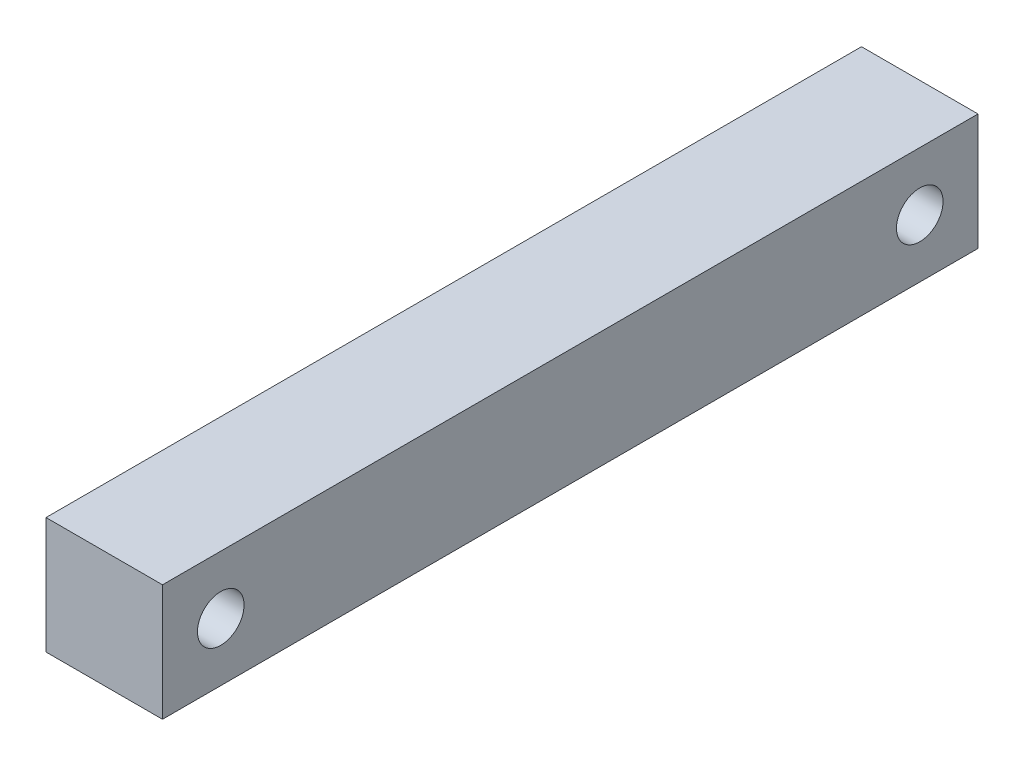
ISO-10303-21;
HEADER;
FILE_DESCRIPTION(('STEP AP214'),'2;1');
FILE_NAME('part.step','',(''),(''),'','','');
FILE_SCHEMA(('AUTOMOTIVE_DESIGN { 1 0 10303 214 1 1 1 1 }'));
ENDSEC;
DATA;
#1=APPLICATION_CONTEXT('core data for automotive mechanical design processes');
#2=APPLICATION_PROTOCOL_DEFINITION('international standard','automotive_design',2000,#1);
#3=PRODUCT_CONTEXT('',#1,'mechanical');
#4=PRODUCT('Part','Part','',(#3));
#5=PRODUCT_RELATED_PRODUCT_CATEGORY('part','',(#4));
#6=PRODUCT_DEFINITION_FORMATION('','',#4);
#7=PRODUCT_DEFINITION_CONTEXT('part definition',#1,'design');
#8=PRODUCT_DEFINITION('design','',#6,#7);
#9=PRODUCT_DEFINITION_SHAPE('','',#8);
#10=(LENGTH_UNIT() NAMED_UNIT(*) SI_UNIT(.MILLI.,.METRE.));
#11=(NAMED_UNIT(*) PLANE_ANGLE_UNIT() SI_UNIT($,.RADIAN.));
#12=(NAMED_UNIT(*) SI_UNIT($,.STERADIAN.) SOLID_ANGLE_UNIT());
#13=UNCERTAINTY_MEASURE_WITH_UNIT(LENGTH_MEASURE(1.E-05),#10,'distance_accuracy_value','');
#14=(GEOMETRIC_REPRESENTATION_CONTEXT(3) GLOBAL_UNCERTAINTY_ASSIGNED_CONTEXT((#13)) GLOBAL_UNIT_ASSIGNED_CONTEXT((#10,
#11,#12)) REPRESENTATION_CONTEXT('',''));
#15=CARTESIAN_POINT('',(0.,0.,0.));
#16=DIRECTION('',(0.,0.,1.));
#17=DIRECTION('',(1.,0.,0.));
#18=AXIS2_PLACEMENT_3D('',#15,#16,#17);
#19=CARTESIAN_POINT('',(2.5,5.,-17.5));
#20=DIRECTION('',(-1.,0.,0.));
#21=DIRECTION('',(0.,0.,1.));
#22=AXIS2_PLACEMENT_3D('',#19,#20,#21);
#23=PLANE('',#22);
#24=CARTESIAN_POINT('',(2.5,2.5,15.));
#25=DIRECTION('',(-1.,0.,0.));
#26=DIRECTION('',(0.,0.,1.));
#27=AXIS2_PLACEMENT_3D('',#24,#25,#26);
#28=CIRCLE('',#27,1.);
#29=CARTESIAN_POINT('',(2.5,2.5,14.));
#30=VERTEX_POINT('',#29);
#31=EDGE_CURVE('E116',#30,#30,#28,.T.);
#32=ORIENTED_EDGE('',*,*,#31,.T.);
#33=EDGE_LOOP('',(#32));
#34=FACE_BOUND('',#33,.T.);
#35=CARTESIAN_POINT('',(2.5,2.5,-15.));
#36=DIRECTION('',(1.,0.,0.));
#37=DIRECTION('',(0.,0.,-1.));
#38=AXIS2_PLACEMENT_3D('',#35,#36,#37);
#39=CIRCLE('',#38,1.);
#40=CARTESIAN_POINT('',(2.5,2.5,-16.));
#41=VERTEX_POINT('',#40);
#42=EDGE_CURVE('E110',#41,#41,#39,.T.);
#43=ORIENTED_EDGE('',*,*,#42,.F.);
#44=EDGE_LOOP('',(#43));
#45=FACE_BOUND('',#44,.T.);
#46=DIRECTION('',(0.,0.,-1.));
#47=VECTOR('',#46,1.);
#48=CARTESIAN_POINT('',(2.5,0.,-17.5));
#49=LINE('',#48,#47);
#50=CARTESIAN_POINT('',(2.5,0.,17.5));
#51=VERTEX_POINT('',#50);
#52=CARTESIAN_POINT('',(2.5,0.,-17.5));
#53=VERTEX_POINT('',#52);
#54=EDGE_CURVE('E96',#51,#53,#49,.T.);
#55=ORIENTED_EDGE('',*,*,#54,.T.);
#56=DIRECTION('',(0.,-1.,0.));
#57=VECTOR('',#56,1.);
#58=CARTESIAN_POINT('',(2.5,5.,-17.5));
#59=LINE('',#58,#57);
#60=CARTESIAN_POINT('',(2.5,5.,-17.5));
#61=VERTEX_POINT('',#60);
#62=EDGE_CURVE('E11',#61,#53,#59,.T.);
#63=ORIENTED_EDGE('',*,*,#62,.F.);
#64=DIRECTION('',(0.,0.,-1.));
#65=VECTOR('',#64,1.);
#66=CARTESIAN_POINT('',(2.5,5.,-17.5));
#67=LINE('',#66,#65);
#68=CARTESIAN_POINT('',(2.5,5.,17.5));
#69=VERTEX_POINT('',#68);
#70=EDGE_CURVE('E84',#69,#61,#67,.T.);
#71=ORIENTED_EDGE('',*,*,#70,.F.);
#72=DIRECTION('',(0.,-1.,0.));
#73=VECTOR('',#72,1.);
#74=CARTESIAN_POINT('',(2.5,5.,17.5));
#75=LINE('',#74,#73);
#76=EDGE_CURVE('E92',#69,#51,#75,.T.);
#77=ORIENTED_EDGE('',*,*,#76,.T.);
#78=EDGE_LOOP('',(#55,#63,#71,#77));
#79=FACE_BOUND('',#78,.T.);
#80=ADVANCED_FACE('F33',(#34,#45,#79),#23,.F.);
#81=CARTESIAN_POINT('',(-2.5,5.,-17.5));
#82=DIRECTION('',(0.,0.,1.));
#83=DIRECTION('',(1.,0.,0.));
#84=AXIS2_PLACEMENT_3D('',#81,#82,#83);
#85=PLANE('',#84);
#86=DIRECTION('',(-1.,0.,0.));
#87=VECTOR('',#86,1.);
#88=CARTESIAN_POINT('',(-2.5,0.,-17.5));
#89=LINE('',#88,#87);
#90=CARTESIAN_POINT('',(-2.5,0.,-17.5));
#91=VERTEX_POINT('',#90);
#92=EDGE_CURVE('E88',#53,#91,#89,.T.);
#93=ORIENTED_EDGE('',*,*,#92,.T.);
#94=DIRECTION('',(0.,-1.,0.));
#95=VECTOR('',#94,1.);
#96=CARTESIAN_POINT('',(-2.5,5.,-17.5));
#97=LINE('',#96,#95);
#98=CARTESIAN_POINT('',(-2.5,5.,-17.5));
#99=VERTEX_POINT('',#98);
#100=EDGE_CURVE('E41',#99,#91,#97,.T.);
#101=ORIENTED_EDGE('',*,*,#100,.F.);
#102=DIRECTION('',(-1.,0.,0.));
#103=VECTOR('',#102,1.);
#104=CARTESIAN_POINT('',(-2.5,5.,-17.5));
#105=LINE('',#104,#103);
#106=EDGE_CURVE('E79',#61,#99,#105,.T.);
#107=ORIENTED_EDGE('',*,*,#106,.F.);
#108=ORIENTED_EDGE('',*,*,#62,.T.);
#109=EDGE_LOOP('',(#93,#101,#107,#108));
#110=FACE_BOUND('',#109,.T.);
#111=ADVANCED_FACE('F87',(#110),#85,.F.);
#112=CARTESIAN_POINT('',(-2.5,5.,-17.5));
#113=DIRECTION('',(1.,0.,0.));
#114=DIRECTION('',(0.,0.,-1.));
#115=AXIS2_PLACEMENT_3D('',#112,#113,#114);
#116=PLANE('',#115);
#117=CARTESIAN_POINT('',(-2.50000000000001,2.5,15.));
#118=DIRECTION('',(-1.,0.,0.));
#119=DIRECTION('',(0.,0.,1.));
#120=AXIS2_PLACEMENT_3D('',#117,#118,#119);
#121=CIRCLE('',#120,1.);
#122=CARTESIAN_POINT('',(-2.50000000000001,2.5,14.));
#123=VERTEX_POINT('',#122);
#124=EDGE_CURVE('E113',#123,#123,#121,.T.);
#125=ORIENTED_EDGE('',*,*,#124,.F.);
#126=EDGE_LOOP('',(#125));
#127=FACE_BOUND('',#126,.T.);
#128=CARTESIAN_POINT('',(-2.50000000000001,2.5,-15.));
#129=DIRECTION('',(1.,0.,0.));
#130=DIRECTION('',(0.,0.,-1.));
#131=AXIS2_PLACEMENT_3D('',#128,#129,#130);
#132=CIRCLE('',#131,1.);
#133=CARTESIAN_POINT('',(-2.50000000000001,2.5,-16.));
#134=VERTEX_POINT('',#133);
#135=EDGE_CURVE('E99',#134,#134,#132,.T.);
#136=ORIENTED_EDGE('',*,*,#135,.T.);
#137=EDGE_LOOP('',(#136));
#138=FACE_BOUND('',#137,.T.);
#139=DIRECTION('',(0.,0.,1.));
#140=VECTOR('',#139,1.);
#141=CARTESIAN_POINT('',(-2.5,0.,-17.5));
#142=LINE('',#141,#140);
#143=CARTESIAN_POINT('',(-2.5,0.,17.5));
#144=VERTEX_POINT('',#143);
#145=EDGE_CURVE('E66',#91,#144,#142,.T.);
#146=ORIENTED_EDGE('',*,*,#145,.T.);
#147=DIRECTION('',(0.,-1.,0.));
#148=VECTOR('',#147,1.);
#149=CARTESIAN_POINT('',(-2.5,5.,17.5));
#150=LINE('',#149,#148);
#151=CARTESIAN_POINT('',(-2.5,5.,17.5));
#152=VERTEX_POINT('',#151);
#153=EDGE_CURVE('E89',#152,#144,#150,.T.);
#154=ORIENTED_EDGE('',*,*,#153,.F.);
#155=DIRECTION('',(0.,0.,1.));
#156=VECTOR('',#155,1.);
#157=CARTESIAN_POINT('',(-2.5,5.,-17.5));
#158=LINE('',#157,#156);
#159=EDGE_CURVE('E82',#99,#152,#158,.T.);
#160=ORIENTED_EDGE('',*,*,#159,.F.);
#161=ORIENTED_EDGE('',*,*,#100,.T.);
#162=EDGE_LOOP('',(#146,#154,#160,#161));
#163=FACE_BOUND('',#162,.T.);
#164=ADVANCED_FACE('F90',(#127,#138,#163),#116,.F.);
#165=CARTESIAN_POINT('',(-2.5,5.,17.5));
#166=DIRECTION('',(0.,0.,-1.));
#167=DIRECTION('',(-1.,0.,0.));
#168=AXIS2_PLACEMENT_3D('',#165,#166,#167);
#169=PLANE('',#168);
#170=DIRECTION('',(1.,0.,0.));
#171=VECTOR('',#170,1.);
#172=CARTESIAN_POINT('',(-2.5,0.,17.5));
#173=LINE('',#172,#171);
#174=EDGE_CURVE('E72',#144,#51,#173,.T.);
#175=ORIENTED_EDGE('',*,*,#174,.T.);
#176=ORIENTED_EDGE('',*,*,#76,.F.);
#177=DIRECTION('',(1.,0.,0.));
#178=VECTOR('',#177,1.);
#179=CARTESIAN_POINT('',(-2.5,5.,17.5));
#180=LINE('',#179,#178);
#181=EDGE_CURVE('E49',#152,#69,#180,.T.);
#182=ORIENTED_EDGE('',*,*,#181,.F.);
#183=ORIENTED_EDGE('',*,*,#153,.T.);
#184=EDGE_LOOP('',(#175,#176,#182,#183));
#185=FACE_BOUND('',#184,.T.);
#186=ADVANCED_FACE('F104',(#185),#169,.F.);
#187=CARTESIAN_POINT('',(0.,5.,0.));
#188=DIRECTION('',(0.,1.,0.));
#189=DIRECTION('',(0.,0.,1.));
#190=AXIS2_PLACEMENT_3D('',#187,#188,#189);
#191=PLANE('',#190);
#192=ORIENTED_EDGE('',*,*,#70,.T.);
#193=ORIENTED_EDGE('',*,*,#106,.T.);
#194=ORIENTED_EDGE('',*,*,#159,.T.);
#195=ORIENTED_EDGE('',*,*,#181,.T.);
#196=EDGE_LOOP('',(#192,#193,#194,#195));
#197=FACE_BOUND('',#196,.T.);
#198=ADVANCED_FACE('F80',(#197),#191,.T.);
#199=CARTESIAN_POINT('',(0.,0.,0.));
#200=DIRECTION('',(0.,1.,0.));
#201=DIRECTION('',(0.,0.,1.));
#202=AXIS2_PLACEMENT_3D('',#199,#200,#201);
#203=PLANE('',#202);
#204=ORIENTED_EDGE('',*,*,#54,.F.);
#205=ORIENTED_EDGE('',*,*,#174,.F.);
#206=ORIENTED_EDGE('',*,*,#145,.F.);
#207=ORIENTED_EDGE('',*,*,#92,.F.);
#208=EDGE_LOOP('',(#204,#205,#206,#207));
#209=FACE_BOUND('',#208,.T.);
#210=ADVANCED_FACE('F107',(#209),#203,.F.);
#211=CARTESIAN_POINT('',(-2.50000000000001,2.5,-15.));
#212=DIRECTION('',(1.,0.,0.));
#213=DIRECTION('',(0.,0.,-1.));
#214=AXIS2_PLACEMENT_3D('',#211,#212,#213);
#215=CYLINDRICAL_SURFACE('',#214,1.);
#216=ORIENTED_EDGE('',*,*,#135,.F.);
#217=EDGE_LOOP('',(#216));
#218=FACE_BOUND('',#217,.T.);
#219=ORIENTED_EDGE('',*,*,#42,.T.);
#220=EDGE_LOOP('',(#219));
#221=FACE_BOUND('',#220,.T.);
#222=ADVANCED_FACE('F130',(#218,#221),#215,.F.);
#223=CARTESIAN_POINT('',(-2.50000000000001,2.5,15.));
#224=DIRECTION('',(1.,0.,0.));
#225=DIRECTION('',(0.,0.,-1.));
#226=AXIS2_PLACEMENT_3D('',#223,#224,#225);
#227=CYLINDRICAL_SURFACE('',#226,1.);
#228=CARTESIAN_POINT('',(-2.50000000000001,2.5,14.));
#229=CARTESIAN_POINT('',(-2.44791666666668,2.5,14.));
#230=CARTESIAN_POINT('',(-2.39583333333335,2.5,14.));
#231=CARTESIAN_POINT('',(-2.29166666666668,2.5,14.));
#232=CARTESIAN_POINT('',(-2.23958333333334,2.5,14.));
#233=CARTESIAN_POINT('',(-2.13541666666668,2.5,14.));
#234=CARTESIAN_POINT('',(-2.08333333333334,2.5,14.));
#235=CARTESIAN_POINT('',(-1.97916666666668,2.5,14.));
#236=CARTESIAN_POINT('',(-1.92708333333334,2.5,14.));
#237=CARTESIAN_POINT('',(-1.82291666666668,2.5,14.));
#238=CARTESIAN_POINT('',(-1.77083333333334,2.5,14.));
#239=CARTESIAN_POINT('',(-1.66666666666668,2.5,14.));
#240=CARTESIAN_POINT('',(-1.61458333333334,2.5,14.));
#241=CARTESIAN_POINT('',(-1.51041666666668,2.5,14.));
#242=CARTESIAN_POINT('',(-1.45833333333334,2.5,14.));
#243=CARTESIAN_POINT('',(-1.35416666666668,2.5,14.));
#244=CARTESIAN_POINT('',(-1.30208333333334,2.5,14.));
#245=CARTESIAN_POINT('',(-1.19791666666668,2.5,14.));
#246=CARTESIAN_POINT('',(-1.14583333333334,2.5,14.));
#247=CARTESIAN_POINT('',(-1.04166666666668,2.5,14.));
#248=CARTESIAN_POINT('',(-0.989583333333342,2.5,14.));
#249=CARTESIAN_POINT('',(-0.885416666666675,2.5,14.));
#250=CARTESIAN_POINT('',(-0.833333333333341,2.5,14.));
#251=CARTESIAN_POINT('',(-0.729166666666674,2.5,14.));
#252=CARTESIAN_POINT('',(-0.677083333333341,2.5,14.));
#253=CARTESIAN_POINT('',(-0.572916666666674,2.5,14.));
#254=CARTESIAN_POINT('',(-0.520833333333341,2.5,14.));
#255=CARTESIAN_POINT('',(-0.416666666666674,2.5,14.));
#256=CARTESIAN_POINT('',(-0.364583333333341,2.5,14.));
#257=CARTESIAN_POINT('',(-0.260416666666674,2.5,14.));
#258=CARTESIAN_POINT('',(-0.20833333333334,2.5,14.));
#259=CARTESIAN_POINT('',(-0.104166666666673,2.5,14.));
#260=CARTESIAN_POINT('',(-0.0520833333333399,2.5,14.));
#261=CARTESIAN_POINT('',(0.0520833333333269,2.5,14.));
#262=CARTESIAN_POINT('',(0.10416666666666,2.5,14.));
#263=CARTESIAN_POINT('',(0.208333333333327,2.5,14.));
#264=CARTESIAN_POINT('',(0.260416666666661,2.5,14.));
#265=CARTESIAN_POINT('',(0.364583333333328,2.5,14.));
#266=CARTESIAN_POINT('',(0.416666666666661,2.5,14.));
#267=CARTESIAN_POINT('',(0.520833333333328,2.5,14.));
#268=CARTESIAN_POINT('',(0.572916666666662,2.5,14.));
#269=CARTESIAN_POINT('',(0.677083333333328,2.5,14.));
#270=CARTESIAN_POINT('',(0.729166666666662,2.5,14.));
#271=CARTESIAN_POINT('',(0.833333333333329,2.5,14.));
#272=CARTESIAN_POINT('',(0.885416666666662,2.5,14.));
#273=CARTESIAN_POINT('',(0.989583333333329,2.5,14.));
#274=CARTESIAN_POINT('',(1.04166666666666,2.5,14.));
#275=CARTESIAN_POINT('',(1.14583333333333,2.5,14.));
#276=CARTESIAN_POINT('',(1.19791666666666,2.5,14.));
#277=CARTESIAN_POINT('',(1.30208333333333,2.5,14.));
#278=CARTESIAN_POINT('',(1.35416666666666,2.5,14.));
#279=CARTESIAN_POINT('',(1.45833333333333,2.5,14.));
#280=CARTESIAN_POINT('',(1.51041666666666,2.5,14.));
#281=CARTESIAN_POINT('',(1.61458333333333,2.5,14.));
#282=CARTESIAN_POINT('',(1.66666666666666,2.5,14.));
#283=CARTESIAN_POINT('',(1.77083333333333,2.5,14.));
#284=CARTESIAN_POINT('',(1.82291666666666,2.5,14.));
#285=CARTESIAN_POINT('',(1.92708333333333,2.5,14.));
#286=CARTESIAN_POINT('',(1.97916666666666,2.5,14.));
#287=CARTESIAN_POINT('',(2.08333333333333,2.5,14.));
#288=CARTESIAN_POINT('',(2.13541666666666,2.5,14.));
#289=CARTESIAN_POINT('',(2.23958333333333,2.5,14.));
#290=CARTESIAN_POINT('',(2.29166666666667,2.5,14.));
#291=CARTESIAN_POINT('',(2.39583333333333,2.5,14.));
#292=CARTESIAN_POINT('',(2.44791666666667,2.5,14.));
#293=CARTESIAN_POINT('',(2.5,2.5,14.));
#294=B_SPLINE_CURVE_WITH_KNOTS('',3,(#228,#229,#230,#231,#232,#233,#234,#235,#236,#237,#238,
#239,#240,#241,#242,#243,#244,#245,#246,#247,#248,#249,#250,#251,#252,#253,#254,#255,#256,#257,
#258,#259,#260,#261,#262,#263,#264,#265,#266,#267,#268,#269,#270,#271,#272,#273,#274,#275,#276,
#277,#278,#279,#280,#281,#282,#283,#284,#285,#286,#287,#288,#289,#290,#291,#292,#293),
.UNSPECIFIED.,.F.,.F.,(4,2,2,2,2,2,2,2,2,2,2,2,2,2,2,2,2,2,2,2,2,2,2,2,2,2,2,2,2,2,2,2,4),(0.,
0.156250000000001,0.312500000000001,0.468750000000001,0.625000000000001,0.781250000000002,
0.937500000000002,1.09375,1.25,1.40625,1.5625,1.71875,1.875,2.03125,2.1875,2.34375000000001,
2.50000000000001,2.65625000000001,2.81250000000001,2.96875000000001,3.12500000000001,
3.28125000000001,3.43750000000001,3.59375000000001,3.75000000000001,3.90625000000001,
4.06250000000001,4.21875000000001,4.37500000000001,4.53125000000001,4.68750000000001,
4.84375000000001,5.00000000000001),.UNSPECIFIED.);
#295=EDGE_CURVE('BSEAM122',#123,#30,#294,.T.);
#296=ORIENTED_EDGE('',*,*,#124,.T.);
#297=ORIENTED_EDGE('',*,*,#31,.F.);
#298=ORIENTED_EDGE('',*,*,#295,.T.);
#299=ORIENTED_EDGE('',*,*,#295,.F.);
#300=EDGE_LOOP('',(#296,#298,#297,#299));
#301=FACE_BOUND('',#300,.T.);
#302=ADVANCED_FACE('F122',(#301),#227,.F.);
#303=CLOSED_SHELL('',(#80,#111,#164,#186,#198,#210,#222,#302));
#304=MANIFOLD_SOLID_BREP('B2',#303);
#305=ADVANCED_BREP_SHAPE_REPRESENTATION('',(#18,#304),#14);
#306=SHAPE_DEFINITION_REPRESENTATION(#9,#305);
ENDSEC;
END-ISO-10303-21;
